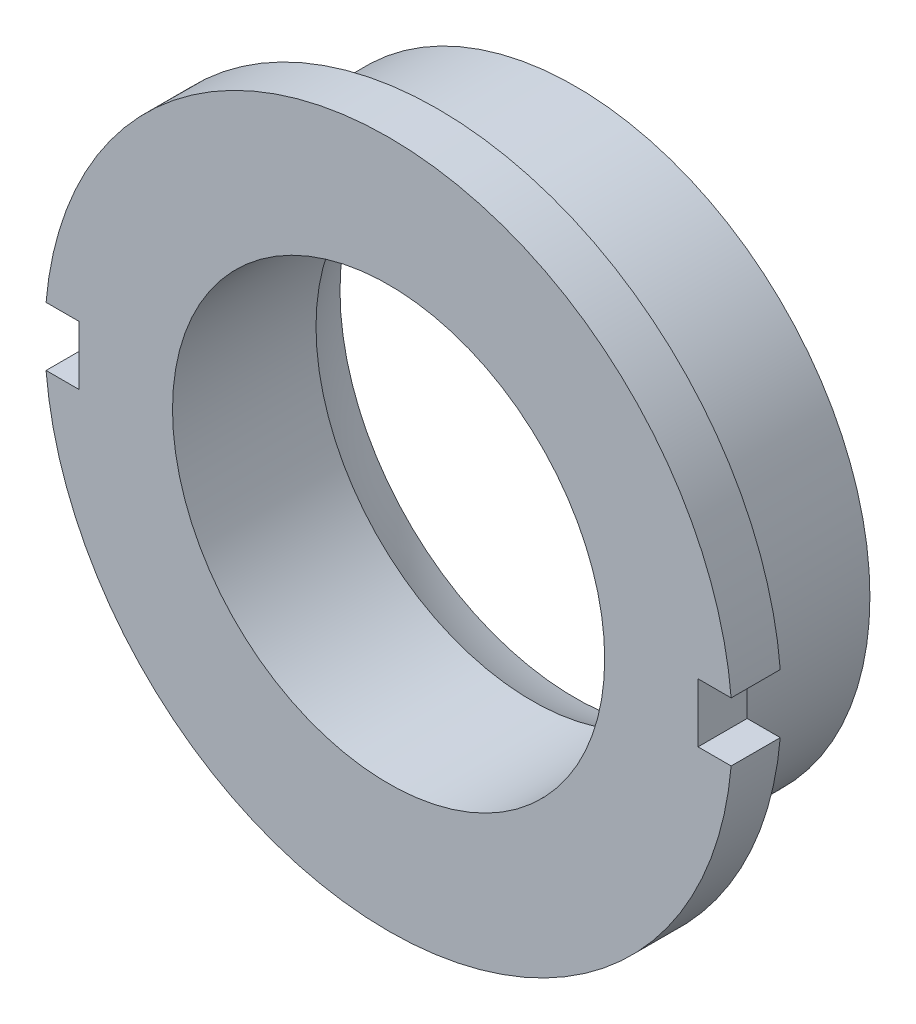
ISO-10303-21;
HEADER;
FILE_DESCRIPTION(('STEP AP214'),'2;1');
FILE_NAME('part.step','',(''),(''),'','','');
FILE_SCHEMA(('AUTOMOTIVE_DESIGN { 1 0 10303 214 1 1 1 1 }'));
ENDSEC;
DATA;
#1=APPLICATION_CONTEXT('core data for automotive mechanical design processes');
#2=APPLICATION_PROTOCOL_DEFINITION('international standard','automotive_design',2000,#1);
#3=PRODUCT_CONTEXT('',#1,'mechanical');
#4=PRODUCT('Part','Part','',(#3));
#5=PRODUCT_RELATED_PRODUCT_CATEGORY('part','',(#4));
#6=PRODUCT_DEFINITION_FORMATION('','',#4);
#7=PRODUCT_DEFINITION_CONTEXT('part definition',#1,'design');
#8=PRODUCT_DEFINITION('design','',#6,#7);
#9=PRODUCT_DEFINITION_SHAPE('','',#8);
#10=(LENGTH_UNIT() NAMED_UNIT(*) SI_UNIT(.MILLI.,.METRE.));
#11=(NAMED_UNIT(*) PLANE_ANGLE_UNIT() SI_UNIT($,.RADIAN.));
#12=(NAMED_UNIT(*) SI_UNIT($,.STERADIAN.) SOLID_ANGLE_UNIT());
#13=UNCERTAINTY_MEASURE_WITH_UNIT(LENGTH_MEASURE(1.E-05),#10,'distance_accuracy_value','');
#14=(GEOMETRIC_REPRESENTATION_CONTEXT(3) GLOBAL_UNCERTAINTY_ASSIGNED_CONTEXT((#13)) GLOBAL_UNIT_ASSIGNED_CONTEXT((#10,
#11,#12)) REPRESENTATION_CONTEXT('',''));
#15=CARTESIAN_POINT('',(0.,0.,0.));
#16=DIRECTION('',(0.,0.,1.));
#17=DIRECTION('',(1.,0.,0.));
#18=AXIS2_PLACEMENT_3D('',#15,#16,#17);
#19=CARTESIAN_POINT('',(0.,0.,2.7));
#20=DIRECTION('',(0.,0.,-1.));
#21=DIRECTION('',(-1.,0.,0.));
#22=AXIS2_PLACEMENT_3D('',#19,#20,#21);
#23=CYLINDRICAL_SURFACE('',#22,3.5);
#24=CARTESIAN_POINT('',(0.,0.,2.2));
#25=DIRECTION('',(0.,0.,1.));
#26=DIRECTION('',(1.,0.,0.));
#27=AXIS2_PLACEMENT_3D('',#24,#25,#26);
#28=CIRCLE('',#27,3.5);
#29=CARTESIAN_POINT('',(3.48711915483254,0.3,2.2));
#30=VERTEX_POINT('',#29);
#31=CARTESIAN_POINT('',(-3.48711915483254,0.3,2.2));
#32=VERTEX_POINT('',#31);
#33=EDGE_CURVE('E169',#30,#32,#28,.T.);
#34=ORIENTED_EDGE('',*,*,#33,.T.);
#35=DIRECTION('',(0.,0.,-1.));
#36=VECTOR('',#35,1.);
#37=CARTESIAN_POINT('',(-3.48711915483254,0.3,2.7));
#38=LINE('',#37,#36);
#39=CARTESIAN_POINT('',(-3.48711915483254,0.3,2.7));
#40=VERTEX_POINT('',#39);
#41=EDGE_CURVE('E11',#32,#40,#38,.F.);
#42=ORIENTED_EDGE('',*,*,#41,.T.);
#43=CARTESIAN_POINT('',(0.,0.,2.7));
#44=DIRECTION('',(0.,0.,1.));
#45=DIRECTION('',(1.,0.,0.));
#46=AXIS2_PLACEMENT_3D('',#43,#44,#45);
#47=CIRCLE('',#46,3.5);
#48=CARTESIAN_POINT('',(3.48711915483254,0.3,2.7));
#49=VERTEX_POINT('',#48);
#50=EDGE_CURVE('E162',#49,#40,#47,.T.);
#51=ORIENTED_EDGE('',*,*,#50,.F.);
#52=DIRECTION('',(0.,0.,-1.));
#53=VECTOR('',#52,1.);
#54=CARTESIAN_POINT('',(3.48711915483254,0.3,2.7));
#55=LINE('',#54,#53);
#56=EDGE_CURVE('E176',#49,#30,#55,.T.);
#57=ORIENTED_EDGE('',*,*,#56,.T.);
#58=EDGE_LOOP('',(#34,#42,#51,#57));
#59=FACE_BOUND('',#58,.T.);
#60=ADVANCED_FACE('F41',(#59),#23,.T.);
#61=CARTESIAN_POINT('',(0.,0.,0.8));
#62=DIRECTION('',(0.,0.,1.));
#63=DIRECTION('',(1.,0.,0.));
#64=AXIS2_PLACEMENT_3D('',#61,#62,#63);
#65=PLANE('',#64);
#66=CARTESIAN_POINT('',(0.,0.,0.8));
#67=DIRECTION('',(0.,0.,1.));
#68=DIRECTION('',(1.,0.,0.));
#69=AXIS2_PLACEMENT_3D('',#66,#67,#68);
#70=CIRCLE('',#69,2.39491649123722);
#71=CARTESIAN_POINT('',(2.39491649123722,0.,0.8));
#72=VERTEX_POINT('',#71);
#73=EDGE_CURVE('E160',#72,#72,#70,.T.);
#74=ORIENTED_EDGE('',*,*,#73,.T.);
#75=EDGE_LOOP('',(#74));
#76=FACE_BOUND('',#75,.T.);
#77=CARTESIAN_POINT('',(0.,0.,0.8));
#78=DIRECTION('',(0.,0.,1.));
#79=DIRECTION('',(1.,0.,0.));
#80=AXIS2_PLACEMENT_3D('',#77,#78,#79);
#81=CIRCLE('',#80,3.);
#82=CARTESIAN_POINT('',(3.,0.,0.8));
#83=VERTEX_POINT('',#82);
#84=EDGE_CURVE('E167',#83,#83,#81,.T.);
#85=ORIENTED_EDGE('',*,*,#84,.F.);
#86=EDGE_LOOP('',(#85));
#87=FACE_BOUND('',#86,.T.);
#88=ADVANCED_FACE('F212',(#76,#87),#65,.F.);
#89=CARTESIAN_POINT('',(0.,0.,2.2));
#90=DIRECTION('',(0.,0.,-1.));
#91=DIRECTION('',(-1.,0.,0.));
#92=AXIS2_PLACEMENT_3D('',#89,#90,#91);
#93=CYLINDRICAL_SURFACE('',#92,3.);
#94=CARTESIAN_POINT('',(0.,0.,2.2));
#95=DIRECTION('',(0.,0.,1.));
#96=DIRECTION('',(1.,0.,0.));
#97=AXIS2_PLACEMENT_3D('',#94,#95,#96);
#98=CIRCLE('',#97,3.);
#99=CARTESIAN_POINT('',(3.,0.,2.2));
#100=VERTEX_POINT('',#99);
#101=EDGE_CURVE('E174',#100,#100,#98,.T.);
#102=ORIENTED_EDGE('',*,*,#101,.F.);
#103=EDGE_LOOP('',(#102));
#104=FACE_BOUND('',#103,.T.);
#105=ORIENTED_EDGE('',*,*,#84,.T.);
#106=EDGE_LOOP('',(#105));
#107=FACE_BOUND('',#106,.T.);
#108=ADVANCED_FACE('F43',(#104,#107),#93,.T.);
#109=CARTESIAN_POINT('',(0.,0.,2.2));
#110=DIRECTION('',(0.,0.,-1.));
#111=DIRECTION('',(-1.,0.,0.));
#112=AXIS2_PLACEMENT_3D('',#109,#110,#111);
#113=CYLINDRICAL_SURFACE('',#112,2.2);
#114=CARTESIAN_POINT('',(0.,0.,1.23920337313937));
#115=DIRECTION('',(0.,0.,-1.));
#116=DIRECTION('',(-1.,0.,0.));
#117=AXIS2_PLACEMENT_3D('',#114,#115,#116);
#118=CIRCLE('',#117,2.2);
#119=CARTESIAN_POINT('',(-2.2,0.,1.23920337313937));
#120=VERTEX_POINT('',#119);
#121=EDGE_CURVE('E140',#120,#120,#118,.F.);
#122=ORIENTED_EDGE('',*,*,#121,.F.);
#123=EDGE_LOOP('',(#122));
#124=FACE_BOUND('',#123,.T.);
#125=CARTESIAN_POINT('',(0.,0.,2.7));
#126=DIRECTION('',(0.,0.,1.));
#127=DIRECTION('',(1.,0.,0.));
#128=AXIS2_PLACEMENT_3D('',#125,#126,#127);
#129=CIRCLE('',#128,2.2);
#130=CARTESIAN_POINT('',(2.2,0.,2.7));
#131=VERTEX_POINT('',#130);
#132=EDGE_CURVE('E159',#131,#131,#129,.T.);
#133=ORIENTED_EDGE('',*,*,#132,.T.);
#134=EDGE_LOOP('',(#133));
#135=FACE_BOUND('',#134,.T.);
#136=ADVANCED_FACE('F233',(#124,#135),#113,.F.);
#137=CARTESIAN_POINT('',(0.,0.,2.7));
#138=DIRECTION('',(0.,0.,1.));
#139=DIRECTION('',(1.,0.,0.));
#140=AXIS2_PLACEMENT_3D('',#137,#138,#139);
#141=PLANE('',#140);
#142=DIRECTION('',(1.,0.,0.));
#143=VECTOR('',#142,1.);
#144=CARTESIAN_POINT('',(-3.6,-0.3,2.7));
#145=LINE('',#144,#143);
#146=CARTESIAN_POINT('',(-3.48711915483254,-0.3,2.7));
#147=VERTEX_POINT('',#146);
#148=CARTESIAN_POINT('',(-3.15,-0.3,2.7));
#149=VERTEX_POINT('',#148);
#150=EDGE_CURVE('E107',#147,#149,#145,.T.);
#151=ORIENTED_EDGE('',*,*,#150,.F.);
#152=CARTESIAN_POINT('',(3.48711915483254,-0.3,2.7));
#153=VERTEX_POINT('',#152);
#154=EDGE_CURVE('E170',#147,#153,#47,.T.);
#155=ORIENTED_EDGE('',*,*,#154,.T.);
#156=DIRECTION('',(1.,0.,0.));
#157=VECTOR('',#156,1.);
#158=CARTESIAN_POINT('',(3.15,-0.3,2.7));
#159=LINE('',#158,#157);
#160=CARTESIAN_POINT('',(3.15,-0.3,2.7));
#161=VERTEX_POINT('',#160);
#162=EDGE_CURVE('E63',#161,#153,#159,.T.);
#163=ORIENTED_EDGE('',*,*,#162,.F.);
#164=DIRECTION('',(0.,-1.,0.));
#165=VECTOR('',#164,1.);
#166=CARTESIAN_POINT('',(3.15,0.3,2.7));
#167=LINE('',#166,#165);
#168=CARTESIAN_POINT('',(3.15,0.3,2.7));
#169=VERTEX_POINT('',#168);
#170=EDGE_CURVE('E132',#169,#161,#167,.T.);
#171=ORIENTED_EDGE('',*,*,#170,.F.);
#172=DIRECTION('',(-1.,0.,0.));
#173=VECTOR('',#172,1.);
#174=CARTESIAN_POINT('',(3.6,0.3,2.7));
#175=LINE('',#174,#173);
#176=EDGE_CURVE('E144',#49,#169,#175,.T.);
#177=ORIENTED_EDGE('',*,*,#176,.F.);
#178=ORIENTED_EDGE('',*,*,#50,.T.);
#179=DIRECTION('',(-1.,0.,0.));
#180=VECTOR('',#179,1.);
#181=CARTESIAN_POINT('',(-3.15,0.3,2.7));
#182=LINE('',#181,#180);
#183=CARTESIAN_POINT('',(-3.15,0.3,2.7));
#184=VERTEX_POINT('',#183);
#185=EDGE_CURVE('E126',#184,#40,#182,.T.);
#186=ORIENTED_EDGE('',*,*,#185,.F.);
#187=DIRECTION('',(0.,1.,0.));
#188=VECTOR('',#187,1.);
#189=CARTESIAN_POINT('',(-3.15,-0.3,2.7));
#190=LINE('',#189,#188);
#191=EDGE_CURVE('E128',#149,#184,#190,.T.);
#192=ORIENTED_EDGE('',*,*,#191,.F.);
#193=EDGE_LOOP('',(#151,#155,#163,#171,#177,#178,#186,#192));
#194=FACE_BOUND('',#193,.T.);
#195=ORIENTED_EDGE('',*,*,#132,.F.);
#196=EDGE_LOOP('',(#195));
#197=FACE_BOUND('',#196,.T.);
#198=ADVANCED_FACE('F186',(#194,#197),#141,.T.);
#199=CARTESIAN_POINT('',(0.,0.,2.2));
#200=DIRECTION('',(0.,0.,1.));
#201=DIRECTION('',(1.,0.,0.));
#202=AXIS2_PLACEMENT_3D('',#199,#200,#201);
#203=PLANE('',#202);
#204=DIRECTION('',(0.,1.,0.));
#205=VECTOR('',#204,1.);
#206=CARTESIAN_POINT('',(-3.15,-0.3,2.2));
#207=LINE('',#206,#205);
#208=CARTESIAN_POINT('',(-3.15,-0.3,2.2));
#209=VERTEX_POINT('',#208);
#210=CARTESIAN_POINT('',(-3.15,0.3,2.2));
#211=VERTEX_POINT('',#210);
#212=EDGE_CURVE('E119',#209,#211,#207,.T.);
#213=ORIENTED_EDGE('',*,*,#212,.T.);
#214=DIRECTION('',(-1.,0.,0.));
#215=VECTOR('',#214,1.);
#216=CARTESIAN_POINT('',(-3.15,0.3,2.2));
#217=LINE('',#216,#215);
#218=EDGE_CURVE('E114',#211,#32,#217,.T.);
#219=ORIENTED_EDGE('',*,*,#218,.T.);
#220=ORIENTED_EDGE('',*,*,#33,.F.);
#221=DIRECTION('',(-1.,0.,0.));
#222=VECTOR('',#221,1.);
#223=CARTESIAN_POINT('',(3.6,0.3,2.2));
#224=LINE('',#223,#222);
#225=CARTESIAN_POINT('',(3.15,0.3,2.2));
#226=VERTEX_POINT('',#225);
#227=EDGE_CURVE('E143',#30,#226,#224,.T.);
#228=ORIENTED_EDGE('',*,*,#227,.T.);
#229=DIRECTION('',(0.,-1.,0.));
#230=VECTOR('',#229,1.);
#231=CARTESIAN_POINT('',(3.15,0.3,2.2));
#232=LINE('',#231,#230);
#233=CARTESIAN_POINT('',(3.15,-0.3,2.2));
#234=VERTEX_POINT('',#233);
#235=EDGE_CURVE('E150',#226,#234,#232,.T.);
#236=ORIENTED_EDGE('',*,*,#235,.T.);
#237=DIRECTION('',(1.,0.,0.));
#238=VECTOR('',#237,1.);
#239=CARTESIAN_POINT('',(3.15,-0.3,2.2));
#240=LINE('',#239,#238);
#241=CARTESIAN_POINT('',(3.48711915483254,-0.3,2.2));
#242=VERTEX_POINT('',#241);
#243=EDGE_CURVE('E153',#234,#242,#240,.T.);
#244=ORIENTED_EDGE('',*,*,#243,.T.);
#245=CARTESIAN_POINT('',(-3.48711915483254,-0.3,2.2));
#246=VERTEX_POINT('',#245);
#247=EDGE_CURVE('E130',#246,#242,#28,.T.);
#248=ORIENTED_EDGE('',*,*,#247,.F.);
#249=DIRECTION('',(1.,0.,0.));
#250=VECTOR('',#249,1.);
#251=CARTESIAN_POINT('',(-3.6,-0.3,2.2));
#252=LINE('',#251,#250);
#253=EDGE_CURVE('E57',#246,#209,#252,.T.);
#254=ORIENTED_EDGE('',*,*,#253,.T.);
#255=EDGE_LOOP('',(#213,#219,#220,#228,#236,#244,#248,#254));
#256=FACE_BOUND('',#255,.T.);
#257=ORIENTED_EDGE('',*,*,#101,.T.);
#258=EDGE_LOOP('',(#257));
#259=FACE_BOUND('',#258,.T.);
#260=ADVANCED_FACE('F123',(#256,#259),#203,.F.);
#261=ORIENTED_EDGE('',*,*,#154,.F.);
#262=DIRECTION('',(0.,0.,-1.));
#263=VECTOR('',#262,1.);
#264=CARTESIAN_POINT('',(-3.48711915483254,-0.3,2.7));
#265=LINE('',#264,#263);
#266=EDGE_CURVE('E47',#147,#246,#265,.T.);
#267=ORIENTED_EDGE('',*,*,#266,.T.);
#268=ORIENTED_EDGE('',*,*,#247,.T.);
#269=DIRECTION('',(0.,0.,-1.));
#270=VECTOR('',#269,1.);
#271=CARTESIAN_POINT('',(3.48711915483254,-0.3,2.7));
#272=LINE('',#271,#270);
#273=EDGE_CURVE('E173',#242,#153,#272,.F.);
#274=ORIENTED_EDGE('',*,*,#273,.T.);
#275=EDGE_LOOP('',(#261,#267,#268,#274));
#276=FACE_BOUND('',#275,.T.);
#277=ADVANCED_FACE('F184',(#276),#23,.T.);
#278=CARTESIAN_POINT('',(0.,0.,0.));
#279=DIRECTION('',(0.,-1.,0.));
#280=DIRECTION('',(1.,0.,0.));
#281=AXIS2_PLACEMENT_3D('',#278,#279,#280);
#282=SPHERICAL_SURFACE('',#281,2.525);
#283=CARTESIAN_POINT('',(0.,0.,0.));
#284=DIRECTION('',(0.,0.,-1.));
#285=DIRECTION('',(-1.,0.,0.));
#286=AXIS2_PLACEMENT_3D('',#283,#284,#285);
#287=SPHERICAL_SURFACE('',#286,2.525);
#288=ORIENTED_EDGE('',*,*,#121,.T.);
#289=EDGE_LOOP('',(#288));
#290=FACE_BOUND('',#289,.T.);
#291=ORIENTED_EDGE('',*,*,#73,.F.);
#292=EDGE_LOOP('',(#291));
#293=FACE_BOUND('',#292,.T.);
#294=ADVANCED_FACE('F211',(#290,#293),#287,.F.);
#295=CARTESIAN_POINT('',(3.6,0.3,2.2));
#296=DIRECTION('',(0.,1.,0.));
#297=DIRECTION('',(0.,0.,1.));
#298=AXIS2_PLACEMENT_3D('',#295,#296,#297);
#299=PLANE('',#298);
#300=ORIENTED_EDGE('',*,*,#176,.T.);
#301=DIRECTION('',(0.,0.,1.));
#302=VECTOR('',#301,1.);
#303=CARTESIAN_POINT('',(3.15,0.3,2.2));
#304=LINE('',#303,#302);
#305=EDGE_CURVE('E142',#226,#169,#304,.T.);
#306=ORIENTED_EDGE('',*,*,#305,.F.);
#307=ORIENTED_EDGE('',*,*,#227,.F.);
#308=ORIENTED_EDGE('',*,*,#56,.F.);
#309=EDGE_LOOP('',(#300,#306,#307,#308));
#310=FACE_BOUND('',#309,.T.);
#311=ADVANCED_FACE('F196',(#310),#299,.F.);
#312=CARTESIAN_POINT('',(3.15,-0.3,2.2));
#313=DIRECTION('',(0.,-1.,0.));
#314=DIRECTION('',(0.,0.,-1.));
#315=AXIS2_PLACEMENT_3D('',#312,#313,#314);
#316=PLANE('',#315);
#317=ORIENTED_EDGE('',*,*,#243,.F.);
#318=DIRECTION('',(0.,0.,1.));
#319=VECTOR('',#318,1.);
#320=CARTESIAN_POINT('',(3.15,-0.3,2.2));
#321=LINE('',#320,#319);
#322=EDGE_CURVE('E139',#234,#161,#321,.T.);
#323=ORIENTED_EDGE('',*,*,#322,.T.);
#324=ORIENTED_EDGE('',*,*,#162,.T.);
#325=ORIENTED_EDGE('',*,*,#273,.F.);
#326=EDGE_LOOP('',(#317,#323,#324,#325));
#327=FACE_BOUND('',#326,.T.);
#328=ADVANCED_FACE('F201',(#327),#316,.F.);
#329=CARTESIAN_POINT('',(3.15,0.3,2.2));
#330=DIRECTION('',(-1.,0.,0.));
#331=DIRECTION('',(0.,0.,1.));
#332=AXIS2_PLACEMENT_3D('',#329,#330,#331);
#333=PLANE('',#332);
#334=ORIENTED_EDGE('',*,*,#170,.T.);
#335=ORIENTED_EDGE('',*,*,#322,.F.);
#336=ORIENTED_EDGE('',*,*,#235,.F.);
#337=ORIENTED_EDGE('',*,*,#305,.T.);
#338=EDGE_LOOP('',(#334,#335,#336,#337));
#339=FACE_BOUND('',#338,.T.);
#340=ADVANCED_FACE('F203',(#339),#333,.F.);
#341=CARTESIAN_POINT('',(-3.15,0.3,2.2));
#342=DIRECTION('',(0.,1.,0.));
#343=DIRECTION('',(0.,0.,1.));
#344=AXIS2_PLACEMENT_3D('',#341,#342,#343);
#345=PLANE('',#344);
#346=ORIENTED_EDGE('',*,*,#218,.F.);
#347=DIRECTION('',(0.,0.,1.));
#348=VECTOR('',#347,1.);
#349=CARTESIAN_POINT('',(-3.15,0.3,2.2));
#350=LINE('',#349,#348);
#351=EDGE_CURVE('E115',#211,#184,#350,.T.);
#352=ORIENTED_EDGE('',*,*,#351,.T.);
#353=ORIENTED_EDGE('',*,*,#185,.T.);
#354=ORIENTED_EDGE('',*,*,#41,.F.);
#355=EDGE_LOOP('',(#346,#352,#353,#354));
#356=FACE_BOUND('',#355,.T.);
#357=ADVANCED_FACE('F193',(#356),#345,.F.);
#358=CARTESIAN_POINT('',(-3.6,-0.3,2.2));
#359=DIRECTION('',(0.,-1.,0.));
#360=DIRECTION('',(0.,0.,-1.));
#361=AXIS2_PLACEMENT_3D('',#358,#359,#360);
#362=PLANE('',#361);
#363=ORIENTED_EDGE('',*,*,#150,.T.);
#364=DIRECTION('',(0.,0.,1.));
#365=VECTOR('',#364,1.);
#366=CARTESIAN_POINT('',(-3.15,-0.3,2.2));
#367=LINE('',#366,#365);
#368=EDGE_CURVE('E102',#209,#149,#367,.T.);
#369=ORIENTED_EDGE('',*,*,#368,.F.);
#370=ORIENTED_EDGE('',*,*,#253,.F.);
#371=ORIENTED_EDGE('',*,*,#266,.F.);
#372=EDGE_LOOP('',(#363,#369,#370,#371));
#373=FACE_BOUND('',#372,.T.);
#374=ADVANCED_FACE('F106',(#373),#362,.F.);
#375=CARTESIAN_POINT('',(-3.15,-0.3,2.2));
#376=DIRECTION('',(1.,0.,0.));
#377=DIRECTION('',(0.,0.,-1.));
#378=AXIS2_PLACEMENT_3D('',#375,#376,#377);
#379=PLANE('',#378);
#380=ORIENTED_EDGE('',*,*,#191,.T.);
#381=ORIENTED_EDGE('',*,*,#351,.F.);
#382=ORIENTED_EDGE('',*,*,#212,.F.);
#383=ORIENTED_EDGE('',*,*,#368,.T.);
#384=EDGE_LOOP('',(#380,#381,#382,#383));
#385=FACE_BOUND('',#384,.T.);
#386=ADVANCED_FACE('F116',(#385),#379,.F.);
#387=CLOSED_SHELL('',(#60,#88,#108,#136,#198,#260,#277,#294,#311,#328,#340,#357,#374,#386));
#388=MANIFOLD_SOLID_BREP('B2',#387);
#389=ADVANCED_BREP_SHAPE_REPRESENTATION('',(#18,#388),#14);
#390=SHAPE_DEFINITION_REPRESENTATION(#9,#389);
ENDSEC;
END-ISO-10303-21;
